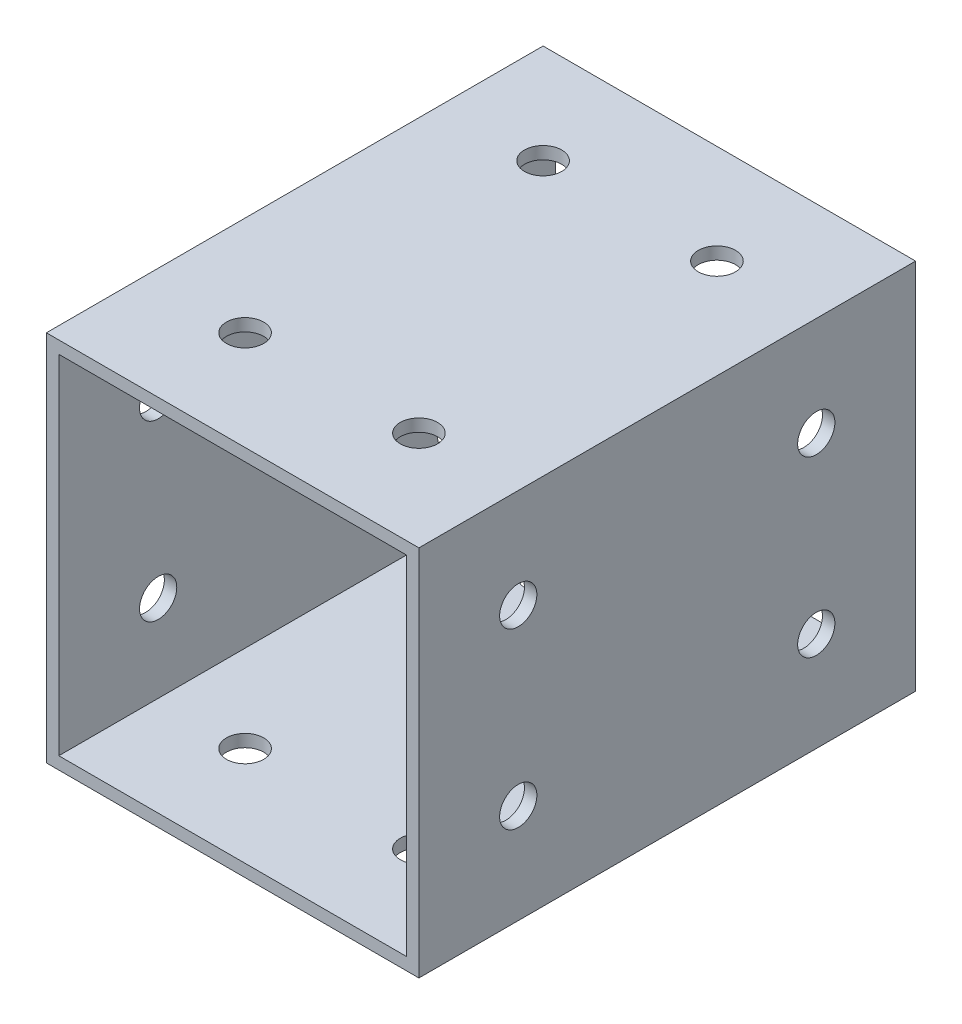
ISO-10303-21;
HEADER;
FILE_DESCRIPTION(('STEP AP214'),'2;1');
FILE_NAME('part.step','',(''),(''),'','','');
FILE_SCHEMA(('AUTOMOTIVE_DESIGN { 1 0 10303 214 1 1 1 1 }'));
ENDSEC;
DATA;
#1=APPLICATION_CONTEXT('core data for automotive mechanical design processes');
#2=APPLICATION_PROTOCOL_DEFINITION('international standard','automotive_design',2000,#1);
#3=PRODUCT_CONTEXT('',#1,'mechanical');
#4=PRODUCT('Part','Part','',(#3));
#5=PRODUCT_RELATED_PRODUCT_CATEGORY('part','',(#4));
#6=PRODUCT_DEFINITION_FORMATION('','',#4);
#7=PRODUCT_DEFINITION_CONTEXT('part definition',#1,'design');
#8=PRODUCT_DEFINITION('design','',#6,#7);
#9=PRODUCT_DEFINITION_SHAPE('','',#8);
#10=(LENGTH_UNIT() NAMED_UNIT(*) SI_UNIT(.MILLI.,.METRE.));
#11=(NAMED_UNIT(*) PLANE_ANGLE_UNIT() SI_UNIT($,.RADIAN.));
#12=(NAMED_UNIT(*) SI_UNIT($,.STERADIAN.) SOLID_ANGLE_UNIT());
#13=UNCERTAINTY_MEASURE_WITH_UNIT(LENGTH_MEASURE(1.E-05),#10,'distance_accuracy_value','');
#14=(GEOMETRIC_REPRESENTATION_CONTEXT(3) GLOBAL_UNCERTAINTY_ASSIGNED_CONTEXT((#13)) GLOBAL_UNIT_ASSIGNED_CONTEXT((#10,
#11,#12)) REPRESENTATION_CONTEXT('',''));
#15=CARTESIAN_POINT('',(0.,0.,0.));
#16=DIRECTION('',(0.,0.,1.));
#17=DIRECTION('',(1.,0.,0.));
#18=AXIS2_PLACEMENT_3D('',#15,#16,#17);
#19=CARTESIAN_POINT('',(0.,0.,40.));
#20=DIRECTION('',(0.,0.,-1.));
#21=DIRECTION('',(-1.,0.,0.));
#22=AXIS2_PLACEMENT_3D('',#19,#20,#21);
#23=PLANE('',#22);
#24=DIRECTION('',(0.,1.,0.));
#25=VECTOR('',#24,1.);
#26=CARTESIAN_POINT('',(15.,-15.,40.));
#27=LINE('',#26,#25);
#28=CARTESIAN_POINT('',(15.,-15.,40.));
#29=VERTEX_POINT('',#28);
#30=CARTESIAN_POINT('',(15.,15.,40.));
#31=VERTEX_POINT('',#30);
#32=EDGE_CURVE('E146',#29,#31,#27,.T.);
#33=ORIENTED_EDGE('',*,*,#32,.T.);
#34=DIRECTION('',(-1.,0.,0.));
#35=VECTOR('',#34,1.);
#36=CARTESIAN_POINT('',(-15.,15.,40.));
#37=LINE('',#36,#35);
#38=CARTESIAN_POINT('',(-15.,15.,40.));
#39=VERTEX_POINT('',#38);
#40=EDGE_CURVE('E149',#31,#39,#37,.T.);
#41=ORIENTED_EDGE('',*,*,#40,.T.);
#42=DIRECTION('',(0.,-1.,0.));
#43=VECTOR('',#42,1.);
#44=CARTESIAN_POINT('',(-15.,-15.,40.));
#45=LINE('',#44,#43);
#46=CARTESIAN_POINT('',(-15.,-15.,40.));
#47=VERTEX_POINT('',#46);
#48=EDGE_CURVE('E152',#39,#47,#45,.T.);
#49=ORIENTED_EDGE('',*,*,#48,.T.);
#50=DIRECTION('',(1.,0.,0.));
#51=VECTOR('',#50,1.);
#52=CARTESIAN_POINT('',(-15.,-15.,40.));
#53=LINE('',#52,#51);
#54=EDGE_CURVE('E154',#47,#29,#53,.T.);
#55=ORIENTED_EDGE('',*,*,#54,.T.);
#56=EDGE_LOOP('',(#33,#41,#49,#55));
#57=FACE_BOUND('',#56,.T.);
#58=DIRECTION('',(0.,1.,0.));
#59=VECTOR('',#58,1.);
#60=CARTESIAN_POINT('',(14.,-14.,40.));
#61=LINE('',#60,#59);
#62=CARTESIAN_POINT('',(14.,-14.,40.));
#63=VERTEX_POINT('',#62);
#64=CARTESIAN_POINT('',(14.,14.,40.));
#65=VERTEX_POINT('',#64);
#66=EDGE_CURVE('E108',#63,#65,#61,.T.);
#67=ORIENTED_EDGE('',*,*,#66,.F.);
#68=DIRECTION('',(1.,0.,0.));
#69=VECTOR('',#68,1.);
#70=CARTESIAN_POINT('',(-14.,-14.,40.));
#71=LINE('',#70,#69);
#72=CARTESIAN_POINT('',(-14.,-14.,40.));
#73=VERTEX_POINT('',#72);
#74=EDGE_CURVE('E130',#73,#63,#71,.T.);
#75=ORIENTED_EDGE('',*,*,#74,.F.);
#76=DIRECTION('',(0.,-1.,0.));
#77=VECTOR('',#76,1.);
#78=CARTESIAN_POINT('',(-14.,-14.,40.));
#79=LINE('',#78,#77);
#80=CARTESIAN_POINT('',(-14.,14.,40.));
#81=VERTEX_POINT('',#80);
#82=EDGE_CURVE('E128',#81,#73,#79,.T.);
#83=ORIENTED_EDGE('',*,*,#82,.F.);
#84=DIRECTION('',(-1.,0.,0.));
#85=VECTOR('',#84,1.);
#86=CARTESIAN_POINT('',(-14.,14.,40.));
#87=LINE('',#86,#85);
#88=EDGE_CURVE('E116',#65,#81,#87,.T.);
#89=ORIENTED_EDGE('',*,*,#88,.F.);
#90=EDGE_LOOP('',(#67,#75,#83,#89));
#91=FACE_BOUND('',#90,.T.);
#92=ADVANCED_FACE('F41',(#57,#91),#23,.F.);
#93=CARTESIAN_POINT('',(0.,0.,0.));
#94=DIRECTION('',(0.,0.,-1.));
#95=DIRECTION('',(-1.,0.,0.));
#96=AXIS2_PLACEMENT_3D('',#93,#94,#95);
#97=PLANE('',#96);
#98=DIRECTION('',(0.,1.,0.));
#99=VECTOR('',#98,1.);
#100=CARTESIAN_POINT('',(15.,-15.,0.));
#101=LINE('',#100,#99);
#102=CARTESIAN_POINT('',(15.,-15.,0.));
#103=VERTEX_POINT('',#102);
#104=CARTESIAN_POINT('',(15.,15.,0.));
#105=VERTEX_POINT('',#104);
#106=EDGE_CURVE('E124',#103,#105,#101,.T.);
#107=ORIENTED_EDGE('',*,*,#106,.F.);
#108=DIRECTION('',(1.,0.,0.));
#109=VECTOR('',#108,1.);
#110=CARTESIAN_POINT('',(-15.,-15.,0.));
#111=LINE('',#110,#109);
#112=CARTESIAN_POINT('',(-15.,-15.,0.));
#113=VERTEX_POINT('',#112);
#114=EDGE_CURVE('E150',#113,#103,#111,.T.);
#115=ORIENTED_EDGE('',*,*,#114,.F.);
#116=DIRECTION('',(0.,-1.,0.));
#117=VECTOR('',#116,1.);
#118=CARTESIAN_POINT('',(-15.,-15.,0.));
#119=LINE('',#118,#117);
#120=CARTESIAN_POINT('',(-15.,15.,0.));
#121=VERTEX_POINT('',#120);
#122=EDGE_CURVE('E161',#121,#113,#119,.T.);
#123=ORIENTED_EDGE('',*,*,#122,.F.);
#124=DIRECTION('',(-1.,0.,0.));
#125=VECTOR('',#124,1.);
#126=CARTESIAN_POINT('',(-15.,15.,0.));
#127=LINE('',#126,#125);
#128=EDGE_CURVE('E159',#105,#121,#127,.T.);
#129=ORIENTED_EDGE('',*,*,#128,.F.);
#130=EDGE_LOOP('',(#107,#115,#123,#129));
#131=FACE_BOUND('',#130,.T.);
#132=DIRECTION('',(1.,0.,0.));
#133=VECTOR('',#132,1.);
#134=CARTESIAN_POINT('',(-14.,-14.,0.));
#135=LINE('',#134,#133);
#136=CARTESIAN_POINT('',(-14.,-14.,0.));
#137=VERTEX_POINT('',#136);
#138=CARTESIAN_POINT('',(14.,-14.,0.));
#139=VERTEX_POINT('',#138);
#140=EDGE_CURVE('E117',#137,#139,#135,.T.);
#141=ORIENTED_EDGE('',*,*,#140,.T.);
#142=DIRECTION('',(0.,1.,0.));
#143=VECTOR('',#142,1.);
#144=CARTESIAN_POINT('',(14.,-14.,0.));
#145=LINE('',#144,#143);
#146=CARTESIAN_POINT('',(14.,14.,0.));
#147=VERTEX_POINT('',#146);
#148=EDGE_CURVE('E66',#139,#147,#145,.T.);
#149=ORIENTED_EDGE('',*,*,#148,.T.);
#150=DIRECTION('',(-1.,0.,0.));
#151=VECTOR('',#150,1.);
#152=CARTESIAN_POINT('',(-14.,14.,0.));
#153=LINE('',#152,#151);
#154=CARTESIAN_POINT('',(-14.,14.,0.));
#155=VERTEX_POINT('',#154);
#156=EDGE_CURVE('E123',#147,#155,#153,.T.);
#157=ORIENTED_EDGE('',*,*,#156,.T.);
#158=DIRECTION('',(0.,-1.,0.));
#159=VECTOR('',#158,1.);
#160=CARTESIAN_POINT('',(-14.,-14.,0.));
#161=LINE('',#160,#159);
#162=EDGE_CURVE('E138',#155,#137,#161,.T.);
#163=ORIENTED_EDGE('',*,*,#162,.T.);
#164=EDGE_LOOP('',(#141,#149,#157,#163));
#165=FACE_BOUND('',#164,.T.);
#166=ADVANCED_FACE('F268',(#131,#165),#97,.T.);
#167=CARTESIAN_POINT('',(15.,-15.,40.));
#168=DIRECTION('',(-1.,0.,0.));
#169=DIRECTION('',(0.,0.,1.));
#170=AXIS2_PLACEMENT_3D('',#167,#168,#169);
#171=PLANE('',#170);
#172=CARTESIAN_POINT('',(15.,-7.00000000000001,8.00000000000001));
#173=DIRECTION('',(-1.,0.,0.));
#174=DIRECTION('',(0.,0.,1.));
#175=AXIS2_PLACEMENT_3D('',#172,#173,#174);
#176=CIRCLE('',#175,1.5);
#177=CARTESIAN_POINT('',(15.,-7.00000000000001,9.50000000000001));
#178=VERTEX_POINT('',#177);
#179=EDGE_CURVE('E219',#178,#178,#176,.T.);
#180=ORIENTED_EDGE('',*,*,#179,.T.);
#181=EDGE_LOOP('',(#180));
#182=FACE_BOUND('',#181,.T.);
#183=CARTESIAN_POINT('',(15.,6.99999999999999,32.));
#184=DIRECTION('',(-1.,0.,0.));
#185=DIRECTION('',(0.,0.,1.));
#186=AXIS2_PLACEMENT_3D('',#183,#184,#185);
#187=CIRCLE('',#186,1.5);
#188=CARTESIAN_POINT('',(15.,6.99999999999999,33.5));
#189=VERTEX_POINT('',#188);
#190=EDGE_CURVE('E226',#189,#189,#187,.T.);
#191=ORIENTED_EDGE('',*,*,#190,.T.);
#192=EDGE_LOOP('',(#191));
#193=FACE_BOUND('',#192,.T.);
#194=CARTESIAN_POINT('',(15.,6.99999999999999,8.00000000000001));
#195=DIRECTION('',(-1.,0.,0.));
#196=DIRECTION('',(0.,0.,1.));
#197=AXIS2_PLACEMENT_3D('',#194,#195,#196);
#198=CIRCLE('',#197,1.5);
#199=CARTESIAN_POINT('',(15.,6.99999999999999,9.50000000000001));
#200=VERTEX_POINT('',#199);
#201=EDGE_CURVE('E213',#200,#200,#198,.T.);
#202=ORIENTED_EDGE('',*,*,#201,.T.);
#203=EDGE_LOOP('',(#202));
#204=FACE_BOUND('',#203,.T.);
#205=CARTESIAN_POINT('',(15.,-7.00000000000001,32.));
#206=DIRECTION('',(-1.,0.,0.));
#207=DIRECTION('',(0.,0.,1.));
#208=AXIS2_PLACEMENT_3D('',#205,#206,#207);
#209=CIRCLE('',#208,1.5);
#210=CARTESIAN_POINT('',(15.,-7.00000000000001,33.5));
#211=VERTEX_POINT('',#210);
#212=EDGE_CURVE('E175',#211,#211,#209,.T.);
#213=ORIENTED_EDGE('',*,*,#212,.T.);
#214=EDGE_LOOP('',(#213));
#215=FACE_BOUND('',#214,.T.);
#216=ORIENTED_EDGE('',*,*,#106,.T.);
#217=DIRECTION('',(0.,0.,-1.));
#218=VECTOR('',#217,1.);
#219=CARTESIAN_POINT('',(15.,15.,40.));
#220=LINE('',#219,#218);
#221=EDGE_CURVE('E11',#31,#105,#220,.T.);
#222=ORIENTED_EDGE('',*,*,#221,.F.);
#223=ORIENTED_EDGE('',*,*,#32,.F.);
#224=DIRECTION('',(0.,0.,-1.));
#225=VECTOR('',#224,1.);
#226=CARTESIAN_POINT('',(15.,-15.,40.));
#227=LINE('',#226,#225);
#228=EDGE_CURVE('E156',#29,#103,#227,.T.);
#229=ORIENTED_EDGE('',*,*,#228,.T.);
#230=EDGE_LOOP('',(#216,#222,#223,#229));
#231=FACE_BOUND('',#230,.T.);
#232=ADVANCED_FACE('F43',(#182,#193,#204,#215,#231),#171,.F.);
#233=CARTESIAN_POINT('',(-15.,15.,40.));
#234=DIRECTION('',(0.,-1.,0.));
#235=DIRECTION('',(0.,0.,-1.));
#236=AXIS2_PLACEMENT_3D('',#233,#234,#235);
#237=PLANE('',#236);
#238=CARTESIAN_POINT('',(-7.,15.,32.));
#239=DIRECTION('',(0.,1.,0.));
#240=DIRECTION('',(0.,0.,1.));
#241=AXIS2_PLACEMENT_3D('',#238,#239,#240);
#242=CIRCLE('',#241,1.5);
#243=CARTESIAN_POINT('',(-7.,15.,33.5));
#244=VERTEX_POINT('',#243);
#245=EDGE_CURVE('E374',#244,#244,#242,.T.);
#246=ORIENTED_EDGE('',*,*,#245,.F.);
#247=EDGE_LOOP('',(#246));
#248=FACE_BOUND('',#247,.T.);
#249=CARTESIAN_POINT('',(7.,15.,8.));
#250=DIRECTION('',(0.,1.,0.));
#251=DIRECTION('',(0.,0.,1.));
#252=AXIS2_PLACEMENT_3D('',#249,#250,#251);
#253=CIRCLE('',#252,1.5);
#254=CARTESIAN_POINT('',(7.,15.,9.5));
#255=VERTEX_POINT('',#254);
#256=EDGE_CURVE('E367',#255,#255,#253,.T.);
#257=ORIENTED_EDGE('',*,*,#256,.F.);
#258=EDGE_LOOP('',(#257));
#259=FACE_BOUND('',#258,.T.);
#260=CARTESIAN_POINT('',(-7.,15.,8.));
#261=DIRECTION('',(0.,1.,0.));
#262=DIRECTION('',(0.,0.,1.));
#263=AXIS2_PLACEMENT_3D('',#260,#261,#262);
#264=CIRCLE('',#263,1.5);
#265=CARTESIAN_POINT('',(-7.,15.,9.5));
#266=VERTEX_POINT('',#265);
#267=EDGE_CURVE('E362',#266,#266,#264,.T.);
#268=ORIENTED_EDGE('',*,*,#267,.F.);
#269=EDGE_LOOP('',(#268));
#270=FACE_BOUND('',#269,.T.);
#271=CARTESIAN_POINT('',(7.,15.,32.));
#272=DIRECTION('',(0.,1.,0.));
#273=DIRECTION('',(0.,0.,1.));
#274=AXIS2_PLACEMENT_3D('',#271,#272,#273);
#275=CIRCLE('',#274,1.5);
#276=CARTESIAN_POINT('',(7.,15.,33.5));
#277=VERTEX_POINT('',#276);
#278=EDGE_CURVE('E373',#277,#277,#275,.T.);
#279=ORIENTED_EDGE('',*,*,#278,.F.);
#280=EDGE_LOOP('',(#279));
#281=FACE_BOUND('',#280,.T.);
#282=ORIENTED_EDGE('',*,*,#128,.T.);
#283=DIRECTION('',(0.,0.,-1.));
#284=VECTOR('',#283,1.);
#285=CARTESIAN_POINT('',(-15.,15.,40.));
#286=LINE('',#285,#284);
#287=EDGE_CURVE('E50',#39,#121,#286,.T.);
#288=ORIENTED_EDGE('',*,*,#287,.F.);
#289=ORIENTED_EDGE('',*,*,#40,.F.);
#290=ORIENTED_EDGE('',*,*,#221,.T.);
#291=EDGE_LOOP('',(#282,#288,#289,#290));
#292=FACE_BOUND('',#291,.T.);
#293=ADVANCED_FACE('F267',(#248,#259,#270,#281,#292),#237,.F.);
#294=CARTESIAN_POINT('',(-15.,-15.,40.));
#295=DIRECTION('',(1.,0.,0.));
#296=DIRECTION('',(0.,0.,-1.));
#297=AXIS2_PLACEMENT_3D('',#294,#295,#296);
#298=PLANE('',#297);
#299=CARTESIAN_POINT('',(-15.,-7.00000000000001,8.00000000000001));
#300=DIRECTION('',(-1.,0.,0.));
#301=DIRECTION('',(0.,0.,1.));
#302=AXIS2_PLACEMENT_3D('',#299,#300,#301);
#303=CIRCLE('',#302,1.5);
#304=CARTESIAN_POINT('',(-15.,-7.00000000000001,9.50000000000001));
#305=VERTEX_POINT('',#304);
#306=EDGE_CURVE('E223',#305,#305,#303,.T.);
#307=ORIENTED_EDGE('',*,*,#306,.F.);
#308=EDGE_LOOP('',(#307));
#309=FACE_BOUND('',#308,.T.);
#310=CARTESIAN_POINT('',(-15.,6.99999999999999,32.));
#311=DIRECTION('',(-1.,0.,0.));
#312=DIRECTION('',(0.,0.,1.));
#313=AXIS2_PLACEMENT_3D('',#310,#311,#312);
#314=CIRCLE('',#313,1.5);
#315=CARTESIAN_POINT('',(-15.,6.99999999999999,33.5));
#316=VERTEX_POINT('',#315);
#317=EDGE_CURVE('E216',#316,#316,#314,.T.);
#318=ORIENTED_EDGE('',*,*,#317,.F.);
#319=EDGE_LOOP('',(#318));
#320=FACE_BOUND('',#319,.T.);
#321=CARTESIAN_POINT('',(-15.,6.99999999999999,8.00000000000001));
#322=DIRECTION('',(-1.,0.,0.));
#323=DIRECTION('',(0.,0.,1.));
#324=AXIS2_PLACEMENT_3D('',#321,#322,#323);
#325=CIRCLE('',#324,1.5);
#326=CARTESIAN_POINT('',(-15.,6.99999999999999,9.50000000000001));
#327=VERTEX_POINT('',#326);
#328=EDGE_CURVE('E212',#327,#327,#325,.T.);
#329=ORIENTED_EDGE('',*,*,#328,.F.);
#330=EDGE_LOOP('',(#329));
#331=FACE_BOUND('',#330,.T.);
#332=CARTESIAN_POINT('',(-15.,-7.00000000000001,32.));
#333=DIRECTION('',(-1.,0.,0.));
#334=DIRECTION('',(0.,0.,1.));
#335=AXIS2_PLACEMENT_3D('',#332,#333,#334);
#336=CIRCLE('',#335,1.5);
#337=CARTESIAN_POINT('',(-15.,-7.00000000000001,33.5));
#338=VERTEX_POINT('',#337);
#339=EDGE_CURVE('E222',#338,#338,#336,.T.);
#340=ORIENTED_EDGE('',*,*,#339,.F.);
#341=EDGE_LOOP('',(#340));
#342=FACE_BOUND('',#341,.T.);
#343=ORIENTED_EDGE('',*,*,#122,.T.);
#344=DIRECTION('',(0.,0.,-1.));
#345=VECTOR('',#344,1.);
#346=CARTESIAN_POINT('',(-15.,-15.,40.));
#347=LINE('',#346,#345);
#348=EDGE_CURVE('E166',#47,#113,#347,.T.);
#349=ORIENTED_EDGE('',*,*,#348,.F.);
#350=ORIENTED_EDGE('',*,*,#48,.F.);
#351=ORIENTED_EDGE('',*,*,#287,.T.);
#352=EDGE_LOOP('',(#343,#349,#350,#351));
#353=FACE_BOUND('',#352,.T.);
#354=ADVANCED_FACE('F286',(#309,#320,#331,#342,#353),#298,.F.);
#355=CARTESIAN_POINT('',(-15.,-15.,40.));
#356=DIRECTION('',(0.,1.,0.));
#357=DIRECTION('',(0.,0.,1.));
#358=AXIS2_PLACEMENT_3D('',#355,#356,#357);
#359=PLANE('',#358);
#360=CARTESIAN_POINT('',(-7.,-15.,32.));
#361=DIRECTION('',(0.,1.,0.));
#362=DIRECTION('',(0.,0.,1.));
#363=AXIS2_PLACEMENT_3D('',#360,#361,#362);
#364=CIRCLE('',#363,1.5);
#365=CARTESIAN_POINT('',(-7.,-15.,33.5));
#366=VERTEX_POINT('',#365);
#367=EDGE_CURVE('E370',#366,#366,#364,.T.);
#368=ORIENTED_EDGE('',*,*,#367,.T.);
#369=EDGE_LOOP('',(#368));
#370=FACE_BOUND('',#369,.T.);
#371=CARTESIAN_POINT('',(7.,-15.,8.));
#372=DIRECTION('',(0.,1.,0.));
#373=DIRECTION('',(0.,0.,1.));
#374=AXIS2_PLACEMENT_3D('',#371,#372,#373);
#375=CIRCLE('',#374,1.5);
#376=CARTESIAN_POINT('',(7.,-15.,9.5));
#377=VERTEX_POINT('',#376);
#378=EDGE_CURVE('E377',#377,#377,#375,.T.);
#379=ORIENTED_EDGE('',*,*,#378,.T.);
#380=EDGE_LOOP('',(#379));
#381=FACE_BOUND('',#380,.T.);
#382=CARTESIAN_POINT('',(-7.,-15.,8.));
#383=DIRECTION('',(0.,1.,0.));
#384=DIRECTION('',(0.,0.,1.));
#385=AXIS2_PLACEMENT_3D('',#382,#383,#384);
#386=CIRCLE('',#385,1.5);
#387=CARTESIAN_POINT('',(-7.,-15.,9.5));
#388=VERTEX_POINT('',#387);
#389=EDGE_CURVE('E364',#388,#388,#386,.T.);
#390=ORIENTED_EDGE('',*,*,#389,.T.);
#391=EDGE_LOOP('',(#390));
#392=FACE_BOUND('',#391,.T.);
#393=CARTESIAN_POINT('',(7.,-15.,32.));
#394=DIRECTION('',(0.,1.,0.));
#395=DIRECTION('',(0.,0.,1.));
#396=AXIS2_PLACEMENT_3D('',#393,#394,#395);
#397=CIRCLE('',#396,1.5);
#398=CARTESIAN_POINT('',(7.,-15.,33.5));
#399=VERTEX_POINT('',#398);
#400=EDGE_CURVE('E191',#399,#399,#397,.T.);
#401=ORIENTED_EDGE('',*,*,#400,.T.);
#402=EDGE_LOOP('',(#401));
#403=FACE_BOUND('',#402,.T.);
#404=ORIENTED_EDGE('',*,*,#114,.T.);
#405=ORIENTED_EDGE('',*,*,#228,.F.);
#406=ORIENTED_EDGE('',*,*,#54,.F.);
#407=ORIENTED_EDGE('',*,*,#348,.T.);
#408=EDGE_LOOP('',(#404,#405,#406,#407));
#409=FACE_BOUND('',#408,.T.);
#410=ADVANCED_FACE('F248',(#370,#381,#392,#403,#409),#359,.F.);
#411=CARTESIAN_POINT('',(14.,-14.,40.));
#412=DIRECTION('',(-1.,0.,0.));
#413=DIRECTION('',(0.,0.,1.));
#414=AXIS2_PLACEMENT_3D('',#411,#412,#413);
#415=PLANE('',#414);
#416=CARTESIAN_POINT('',(14.,-7.00000000000001,8.00000000000001));
#417=DIRECTION('',(-1.,0.,0.));
#418=DIRECTION('',(0.,0.,1.));
#419=AXIS2_PLACEMENT_3D('',#416,#417,#418);
#420=CIRCLE('',#419,1.5);
#421=CARTESIAN_POINT('',(14.,-7.00000000000001,9.50000000000001));
#422=VERTEX_POINT('',#421);
#423=EDGE_CURVE('E136',#422,#422,#420,.T.);
#424=ORIENTED_EDGE('',*,*,#423,.F.);
#425=EDGE_LOOP('',(#424));
#426=FACE_BOUND('',#425,.T.);
#427=CARTESIAN_POINT('',(14.,6.99999999999999,32.));
#428=DIRECTION('',(-1.,0.,0.));
#429=DIRECTION('',(0.,0.,1.));
#430=AXIS2_PLACEMENT_3D('',#427,#428,#429);
#431=CIRCLE('',#430,1.5);
#432=CARTESIAN_POINT('',(14.,6.99999999999999,33.5));
#433=VERTEX_POINT('',#432);
#434=EDGE_CURVE('E183',#433,#433,#431,.T.);
#435=ORIENTED_EDGE('',*,*,#434,.F.);
#436=EDGE_LOOP('',(#435));
#437=FACE_BOUND('',#436,.T.);
#438=CARTESIAN_POINT('',(14.,6.99999999999999,8.00000000000001));
#439=DIRECTION('',(-1.,0.,0.));
#440=DIRECTION('',(0.,0.,1.));
#441=AXIS2_PLACEMENT_3D('',#438,#439,#440);
#442=CIRCLE('',#441,1.5);
#443=CARTESIAN_POINT('',(14.,6.99999999999999,9.50000000000001));
#444=VERTEX_POINT('',#443);
#445=EDGE_CURVE('E179',#444,#444,#442,.T.);
#446=ORIENTED_EDGE('',*,*,#445,.F.);
#447=EDGE_LOOP('',(#446));
#448=FACE_BOUND('',#447,.T.);
#449=CARTESIAN_POINT('',(14.,-7.00000000000001,32.));
#450=DIRECTION('',(-1.,0.,0.));
#451=DIRECTION('',(0.,0.,1.));
#452=AXIS2_PLACEMENT_3D('',#449,#450,#451);
#453=CIRCLE('',#452,1.5);
#454=CARTESIAN_POINT('',(14.,-7.00000000000001,33.5));
#455=VERTEX_POINT('',#454);
#456=EDGE_CURVE('E174',#455,#455,#453,.T.);
#457=ORIENTED_EDGE('',*,*,#456,.F.);
#458=EDGE_LOOP('',(#457));
#459=FACE_BOUND('',#458,.T.);
#460=ORIENTED_EDGE('',*,*,#148,.F.);
#461=DIRECTION('',(0.,0.,-1.));
#462=VECTOR('',#461,1.);
#463=CARTESIAN_POINT('',(14.,-14.,40.));
#464=LINE('',#463,#462);
#465=EDGE_CURVE('E112',#63,#139,#464,.T.);
#466=ORIENTED_EDGE('',*,*,#465,.F.);
#467=ORIENTED_EDGE('',*,*,#66,.T.);
#468=DIRECTION('',(0.,0.,-1.));
#469=VECTOR('',#468,1.);
#470=CARTESIAN_POINT('',(14.,14.,40.));
#471=LINE('',#470,#469);
#472=EDGE_CURVE('E111',#65,#147,#471,.T.);
#473=ORIENTED_EDGE('',*,*,#472,.T.);
#474=EDGE_LOOP('',(#460,#466,#467,#473));
#475=FACE_BOUND('',#474,.T.);
#476=ADVANCED_FACE('F110',(#426,#437,#448,#459,#475),#415,.T.);
#477=CARTESIAN_POINT('',(-14.,14.,40.));
#478=DIRECTION('',(0.,-1.,0.));
#479=DIRECTION('',(0.,0.,-1.));
#480=AXIS2_PLACEMENT_3D('',#477,#478,#479);
#481=PLANE('',#480);
#482=CARTESIAN_POINT('',(-7.,14.,32.));
#483=DIRECTION('',(0.,-1.,0.));
#484=DIRECTION('',(0.,0.,-1.));
#485=AXIS2_PLACEMENT_3D('',#482,#483,#484);
#486=CIRCLE('',#485,1.5);
#487=CARTESIAN_POINT('',(-7.,14.,30.5));
#488=VERTEX_POINT('',#487);
#489=EDGE_CURVE('E209',#488,#488,#486,.T.);
#490=ORIENTED_EDGE('',*,*,#489,.F.);
#491=EDGE_LOOP('',(#490));
#492=FACE_BOUND('',#491,.T.);
#493=CARTESIAN_POINT('',(7.,14.,8.));
#494=DIRECTION('',(0.,-1.,0.));
#495=DIRECTION('',(0.,0.,-1.));
#496=AXIS2_PLACEMENT_3D('',#493,#494,#495);
#497=CIRCLE('',#496,1.5);
#498=CARTESIAN_POINT('',(7.,14.,6.5));
#499=VERTEX_POINT('',#498);
#500=EDGE_CURVE('E197',#499,#499,#497,.T.);
#501=ORIENTED_EDGE('',*,*,#500,.F.);
#502=EDGE_LOOP('',(#501));
#503=FACE_BOUND('',#502,.T.);
#504=CARTESIAN_POINT('',(-7.,14.,8.));
#505=DIRECTION('',(0.,-1.,0.));
#506=DIRECTION('',(0.,0.,-1.));
#507=AXIS2_PLACEMENT_3D('',#504,#505,#506);
#508=CIRCLE('',#507,1.5);
#509=CARTESIAN_POINT('',(-7.,14.,6.5));
#510=VERTEX_POINT('',#509);
#511=EDGE_CURVE('E194',#510,#510,#508,.T.);
#512=ORIENTED_EDGE('',*,*,#511,.F.);
#513=EDGE_LOOP('',(#512));
#514=FACE_BOUND('',#513,.T.);
#515=CARTESIAN_POINT('',(7.,14.,32.));
#516=DIRECTION('',(0.,-1.,0.));
#517=DIRECTION('',(0.,0.,-1.));
#518=AXIS2_PLACEMENT_3D('',#515,#516,#517);
#519=CIRCLE('',#518,1.5);
#520=CARTESIAN_POINT('',(7.,14.,30.5));
#521=VERTEX_POINT('',#520);
#522=EDGE_CURVE('E190',#521,#521,#519,.T.);
#523=ORIENTED_EDGE('',*,*,#522,.F.);
#524=EDGE_LOOP('',(#523));
#525=FACE_BOUND('',#524,.T.);
#526=ORIENTED_EDGE('',*,*,#156,.F.);
#527=ORIENTED_EDGE('',*,*,#472,.F.);
#528=ORIENTED_EDGE('',*,*,#88,.T.);
#529=DIRECTION('',(0.,0.,-1.));
#530=VECTOR('',#529,1.);
#531=CARTESIAN_POINT('',(-14.,14.,40.));
#532=LINE('',#531,#530);
#533=EDGE_CURVE('E125',#81,#155,#532,.T.);
#534=ORIENTED_EDGE('',*,*,#533,.T.);
#535=EDGE_LOOP('',(#526,#527,#528,#534));
#536=FACE_BOUND('',#535,.T.);
#537=ADVANCED_FACE('F120',(#492,#503,#514,#525,#536),#481,.T.);
#538=CARTESIAN_POINT('',(-14.,-14.,40.));
#539=DIRECTION('',(1.,0.,0.));
#540=DIRECTION('',(0.,0.,-1.));
#541=AXIS2_PLACEMENT_3D('',#538,#539,#540);
#542=PLANE('',#541);
#543=CARTESIAN_POINT('',(-14.,-7.00000000000001,8.00000000000001));
#544=DIRECTION('',(1.,0.,0.));
#545=DIRECTION('',(0.,0.,-1.));
#546=AXIS2_PLACEMENT_3D('',#543,#544,#545);
#547=CIRCLE('',#546,1.5);
#548=CARTESIAN_POINT('',(-14.,-7.00000000000001,6.50000000000001));
#549=VERTEX_POINT('',#548);
#550=EDGE_CURVE('E184',#549,#549,#547,.T.);
#551=ORIENTED_EDGE('',*,*,#550,.F.);
#552=EDGE_LOOP('',(#551));
#553=FACE_BOUND('',#552,.T.);
#554=CARTESIAN_POINT('',(-14.,6.99999999999999,32.));
#555=DIRECTION('',(1.,0.,0.));
#556=DIRECTION('',(0.,0.,-1.));
#557=AXIS2_PLACEMENT_3D('',#554,#555,#556);
#558=CIRCLE('',#557,1.5);
#559=CARTESIAN_POINT('',(-14.,6.99999999999999,30.5));
#560=VERTEX_POINT('',#559);
#561=EDGE_CURVE('E180',#560,#560,#558,.T.);
#562=ORIENTED_EDGE('',*,*,#561,.F.);
#563=EDGE_LOOP('',(#562));
#564=FACE_BOUND('',#563,.T.);
#565=CARTESIAN_POINT('',(-14.,6.99999999999999,8.00000000000001));
#566=DIRECTION('',(1.,0.,0.));
#567=DIRECTION('',(0.,0.,-1.));
#568=AXIS2_PLACEMENT_3D('',#565,#566,#567);
#569=CIRCLE('',#568,1.5);
#570=CARTESIAN_POINT('',(-14.,6.99999999999999,6.50000000000001));
#571=VERTEX_POINT('',#570);
#572=EDGE_CURVE('E176',#571,#571,#569,.T.);
#573=ORIENTED_EDGE('',*,*,#572,.F.);
#574=EDGE_LOOP('',(#573));
#575=FACE_BOUND('',#574,.T.);
#576=CARTESIAN_POINT('',(-14.,-7.00000000000001,32.));
#577=DIRECTION('',(1.,0.,0.));
#578=DIRECTION('',(0.,0.,-1.));
#579=AXIS2_PLACEMENT_3D('',#576,#577,#578);
#580=CIRCLE('',#579,1.5);
#581=CARTESIAN_POINT('',(-14.,-7.00000000000001,30.5));
#582=VERTEX_POINT('',#581);
#583=EDGE_CURVE('E171',#582,#582,#580,.T.);
#584=ORIENTED_EDGE('',*,*,#583,.F.);
#585=EDGE_LOOP('',(#584));
#586=FACE_BOUND('',#585,.T.);
#587=ORIENTED_EDGE('',*,*,#162,.F.);
#588=ORIENTED_EDGE('',*,*,#533,.F.);
#589=ORIENTED_EDGE('',*,*,#82,.T.);
#590=DIRECTION('',(0.,0.,-1.));
#591=VECTOR('',#590,1.);
#592=CARTESIAN_POINT('',(-14.,-14.,40.));
#593=LINE('',#592,#591);
#594=EDGE_CURVE('E58',#73,#137,#593,.T.);
#595=ORIENTED_EDGE('',*,*,#594,.T.);
#596=EDGE_LOOP('',(#587,#588,#589,#595));
#597=FACE_BOUND('',#596,.T.);
#598=ADVANCED_FACE('F308',(#553,#564,#575,#586,#597),#542,.T.);
#599=CARTESIAN_POINT('',(-14.,-14.,40.));
#600=DIRECTION('',(0.,1.,0.));
#601=DIRECTION('',(0.,0.,1.));
#602=AXIS2_PLACEMENT_3D('',#599,#600,#601);
#603=PLANE('',#602);
#604=CARTESIAN_POINT('',(-7.,-14.,32.));
#605=DIRECTION('',(0.,1.,0.));
#606=DIRECTION('',(0.,0.,1.));
#607=AXIS2_PLACEMENT_3D('',#604,#605,#606);
#608=CIRCLE('',#607,1.5);
#609=CARTESIAN_POINT('',(-7.,-14.,33.5));
#610=VERTEX_POINT('',#609);
#611=EDGE_CURVE('E45',#610,#610,#608,.T.);
#612=ORIENTED_EDGE('',*,*,#611,.F.);
#613=EDGE_LOOP('',(#612));
#614=FACE_BOUND('',#613,.T.);
#615=CARTESIAN_POINT('',(7.,-14.,8.));
#616=DIRECTION('',(0.,1.,0.));
#617=DIRECTION('',(0.,0.,1.));
#618=AXIS2_PLACEMENT_3D('',#615,#616,#617);
#619=CIRCLE('',#618,1.5);
#620=CARTESIAN_POINT('',(7.,-14.,9.5));
#621=VERTEX_POINT('',#620);
#622=EDGE_CURVE('E195',#621,#621,#619,.T.);
#623=ORIENTED_EDGE('',*,*,#622,.F.);
#624=EDGE_LOOP('',(#623));
#625=FACE_BOUND('',#624,.T.);
#626=CARTESIAN_POINT('',(-7.,-14.,8.));
#627=DIRECTION('',(0.,1.,0.));
#628=DIRECTION('',(0.,0.,1.));
#629=AXIS2_PLACEMENT_3D('',#626,#627,#628);
#630=CIRCLE('',#629,1.5);
#631=CARTESIAN_POINT('',(-7.,-14.,9.5));
#632=VERTEX_POINT('',#631);
#633=EDGE_CURVE('E192',#632,#632,#630,.T.);
#634=ORIENTED_EDGE('',*,*,#633,.F.);
#635=EDGE_LOOP('',(#634));
#636=FACE_BOUND('',#635,.T.);
#637=CARTESIAN_POINT('',(7.,-14.,32.));
#638=DIRECTION('',(0.,1.,0.));
#639=DIRECTION('',(0.,0.,1.));
#640=AXIS2_PLACEMENT_3D('',#637,#638,#639);
#641=CIRCLE('',#640,1.5);
#642=CARTESIAN_POINT('',(7.,-14.,33.5));
#643=VERTEX_POINT('',#642);
#644=EDGE_CURVE('E187',#643,#643,#641,.T.);
#645=ORIENTED_EDGE('',*,*,#644,.F.);
#646=EDGE_LOOP('',(#645));
#647=FACE_BOUND('',#646,.T.);
#648=ORIENTED_EDGE('',*,*,#140,.F.);
#649=ORIENTED_EDGE('',*,*,#594,.F.);
#650=ORIENTED_EDGE('',*,*,#74,.T.);
#651=ORIENTED_EDGE('',*,*,#465,.T.);
#652=EDGE_LOOP('',(#648,#649,#650,#651));
#653=FACE_BOUND('',#652,.T.);
#654=ADVANCED_FACE('F312',(#614,#625,#636,#647,#653),#603,.T.);
#655=CARTESIAN_POINT('',(15.,-7.00000000000001,32.));
#656=DIRECTION('',(-1.,0.,0.));
#657=DIRECTION('',(0.,0.,1.));
#658=AXIS2_PLACEMENT_3D('',#655,#656,#657);
#659=CYLINDRICAL_SURFACE('',#658,1.5);
#660=ORIENTED_EDGE('',*,*,#583,.T.);
#661=EDGE_LOOP('',(#660));
#662=FACE_BOUND('',#661,.T.);
#663=ORIENTED_EDGE('',*,*,#339,.T.);
#664=EDGE_LOOP('',(#663));
#665=FACE_BOUND('',#664,.T.);
#666=ADVANCED_FACE('F262',(#662,#665),#659,.F.);
#667=CARTESIAN_POINT('',(15.,6.99999999999999,8.00000000000001));
#668=DIRECTION('',(-1.,0.,0.));
#669=DIRECTION('',(0.,0.,1.));
#670=AXIS2_PLACEMENT_3D('',#667,#668,#669);
#671=CYLINDRICAL_SURFACE('',#670,1.5);
#672=ORIENTED_EDGE('',*,*,#572,.T.);
#673=EDGE_LOOP('',(#672));
#674=FACE_BOUND('',#673,.T.);
#675=ORIENTED_EDGE('',*,*,#328,.T.);
#676=EDGE_LOOP('',(#675));
#677=FACE_BOUND('',#676,.T.);
#678=ADVANCED_FACE('F318',(#674,#677),#671,.F.);
#679=CARTESIAN_POINT('',(15.,6.99999999999999,32.));
#680=DIRECTION('',(-1.,0.,0.));
#681=DIRECTION('',(0.,0.,1.));
#682=AXIS2_PLACEMENT_3D('',#679,#680,#681);
#683=CYLINDRICAL_SURFACE('',#682,1.5);
#684=ORIENTED_EDGE('',*,*,#561,.T.);
#685=EDGE_LOOP('',(#684));
#686=FACE_BOUND('',#685,.T.);
#687=ORIENTED_EDGE('',*,*,#317,.T.);
#688=EDGE_LOOP('',(#687));
#689=FACE_BOUND('',#688,.T.);
#690=ADVANCED_FACE('F320',(#686,#689),#683,.F.);
#691=CARTESIAN_POINT('',(15.,-7.00000000000001,8.00000000000001));
#692=DIRECTION('',(-1.,0.,0.));
#693=DIRECTION('',(0.,0.,1.));
#694=AXIS2_PLACEMENT_3D('',#691,#692,#693);
#695=CYLINDRICAL_SURFACE('',#694,1.5);
#696=ORIENTED_EDGE('',*,*,#550,.T.);
#697=EDGE_LOOP('',(#696));
#698=FACE_BOUND('',#697,.T.);
#699=ORIENTED_EDGE('',*,*,#306,.T.);
#700=EDGE_LOOP('',(#699));
#701=FACE_BOUND('',#700,.T.);
#702=ADVANCED_FACE('F260',(#698,#701),#695,.F.);
#703=ORIENTED_EDGE('',*,*,#456,.T.);
#704=EDGE_LOOP('',(#703));
#705=FACE_BOUND('',#704,.T.);
#706=ORIENTED_EDGE('',*,*,#212,.F.);
#707=EDGE_LOOP('',(#706));
#708=FACE_BOUND('',#707,.T.);
#709=ADVANCED_FACE('F256',(#705,#708),#659,.F.);
#710=ORIENTED_EDGE('',*,*,#445,.T.);
#711=EDGE_LOOP('',(#710));
#712=FACE_BOUND('',#711,.T.);
#713=ORIENTED_EDGE('',*,*,#201,.F.);
#714=EDGE_LOOP('',(#713));
#715=FACE_BOUND('',#714,.T.);
#716=ADVANCED_FACE('F259',(#712,#715),#671,.F.);
#717=ORIENTED_EDGE('',*,*,#434,.T.);
#718=EDGE_LOOP('',(#717));
#719=FACE_BOUND('',#718,.T.);
#720=ORIENTED_EDGE('',*,*,#190,.F.);
#721=EDGE_LOOP('',(#720));
#722=FACE_BOUND('',#721,.T.);
#723=ADVANCED_FACE('F324',(#719,#722),#683,.F.);
#724=ORIENTED_EDGE('',*,*,#423,.T.);
#725=EDGE_LOOP('',(#724));
#726=FACE_BOUND('',#725,.T.);
#727=ORIENTED_EDGE('',*,*,#179,.F.);
#728=EDGE_LOOP('',(#727));
#729=FACE_BOUND('',#728,.T.);
#730=ADVANCED_FACE('F243',(#726,#729),#695,.F.);
#731=CARTESIAN_POINT('',(7.,-15.,32.));
#732=DIRECTION('',(0.,1.,0.));
#733=DIRECTION('',(0.,0.,1.));
#734=AXIS2_PLACEMENT_3D('',#731,#732,#733);
#735=CYLINDRICAL_SURFACE('',#734,1.5);
#736=ORIENTED_EDGE('',*,*,#644,.T.);
#737=EDGE_LOOP('',(#736));
#738=FACE_BOUND('',#737,.T.);
#739=ORIENTED_EDGE('',*,*,#400,.F.);
#740=EDGE_LOOP('',(#739));
#741=FACE_BOUND('',#740,.T.);
#742=ADVANCED_FACE('F331',(#738,#741),#735,.F.);
#743=CARTESIAN_POINT('',(-7.,-15.,8.));
#744=DIRECTION('',(0.,1.,0.));
#745=DIRECTION('',(0.,0.,1.));
#746=AXIS2_PLACEMENT_3D('',#743,#744,#745);
#747=CYLINDRICAL_SURFACE('',#746,1.5);
#748=ORIENTED_EDGE('',*,*,#633,.T.);
#749=EDGE_LOOP('',(#748));
#750=FACE_BOUND('',#749,.T.);
#751=ORIENTED_EDGE('',*,*,#389,.F.);
#752=EDGE_LOOP('',(#751));
#753=FACE_BOUND('',#752,.T.);
#754=ADVANCED_FACE('F334',(#750,#753),#747,.F.);
#755=CARTESIAN_POINT('',(7.,-15.,8.));
#756=DIRECTION('',(0.,1.,0.));
#757=DIRECTION('',(0.,0.,1.));
#758=AXIS2_PLACEMENT_3D('',#755,#756,#757);
#759=CYLINDRICAL_SURFACE('',#758,1.5);
#760=ORIENTED_EDGE('',*,*,#622,.T.);
#761=EDGE_LOOP('',(#760));
#762=FACE_BOUND('',#761,.T.);
#763=ORIENTED_EDGE('',*,*,#378,.F.);
#764=EDGE_LOOP('',(#763));
#765=FACE_BOUND('',#764,.T.);
#766=ADVANCED_FACE('F337',(#762,#765),#759,.F.);
#767=CARTESIAN_POINT('',(-7.,-15.,32.));
#768=DIRECTION('',(0.,1.,0.));
#769=DIRECTION('',(0.,0.,1.));
#770=AXIS2_PLACEMENT_3D('',#767,#768,#769);
#771=CYLINDRICAL_SURFACE('',#770,1.5);
#772=ORIENTED_EDGE('',*,*,#611,.T.);
#773=EDGE_LOOP('',(#772));
#774=FACE_BOUND('',#773,.T.);
#775=ORIENTED_EDGE('',*,*,#367,.F.);
#776=EDGE_LOOP('',(#775));
#777=FACE_BOUND('',#776,.T.);
#778=ADVANCED_FACE('F340',(#774,#777),#771,.F.);
#779=ORIENTED_EDGE('',*,*,#522,.T.);
#780=EDGE_LOOP('',(#779));
#781=FACE_BOUND('',#780,.T.);
#782=ORIENTED_EDGE('',*,*,#278,.T.);
#783=EDGE_LOOP('',(#782));
#784=FACE_BOUND('',#783,.T.);
#785=ADVANCED_FACE('F336',(#781,#784),#735,.F.);
#786=ORIENTED_EDGE('',*,*,#511,.T.);
#787=EDGE_LOOP('',(#786));
#788=FACE_BOUND('',#787,.T.);
#789=ORIENTED_EDGE('',*,*,#267,.T.);
#790=EDGE_LOOP('',(#789));
#791=FACE_BOUND('',#790,.T.);
#792=ADVANCED_FACE('F348',(#788,#791),#747,.F.);
#793=ORIENTED_EDGE('',*,*,#500,.T.);
#794=EDGE_LOOP('',(#793));
#795=FACE_BOUND('',#794,.T.);
#796=ORIENTED_EDGE('',*,*,#256,.T.);
#797=EDGE_LOOP('',(#796));
#798=FACE_BOUND('',#797,.T.);
#799=ADVANCED_FACE('F341',(#795,#798),#759,.F.);
#800=ORIENTED_EDGE('',*,*,#489,.T.);
#801=EDGE_LOOP('',(#800));
#802=FACE_BOUND('',#801,.T.);
#803=ORIENTED_EDGE('',*,*,#245,.T.);
#804=EDGE_LOOP('',(#803));
#805=FACE_BOUND('',#804,.T.);
#806=ADVANCED_FACE('F345',(#802,#805),#771,.F.);
#807=CLOSED_SHELL('',(#92,#166,#232,#293,#354,#410,#476,#537,#598,#654,#666,#678,#690,#702,#709,
#716,#723,#730,#742,#754,#766,#778,#785,#792,#799,#806));
#808=MANIFOLD_SOLID_BREP('B2',#807);
#809=ADVANCED_BREP_SHAPE_REPRESENTATION('',(#18,#808),#14);
#810=SHAPE_DEFINITION_REPRESENTATION(#9,#809);
ENDSEC;
END-ISO-10303-21;
